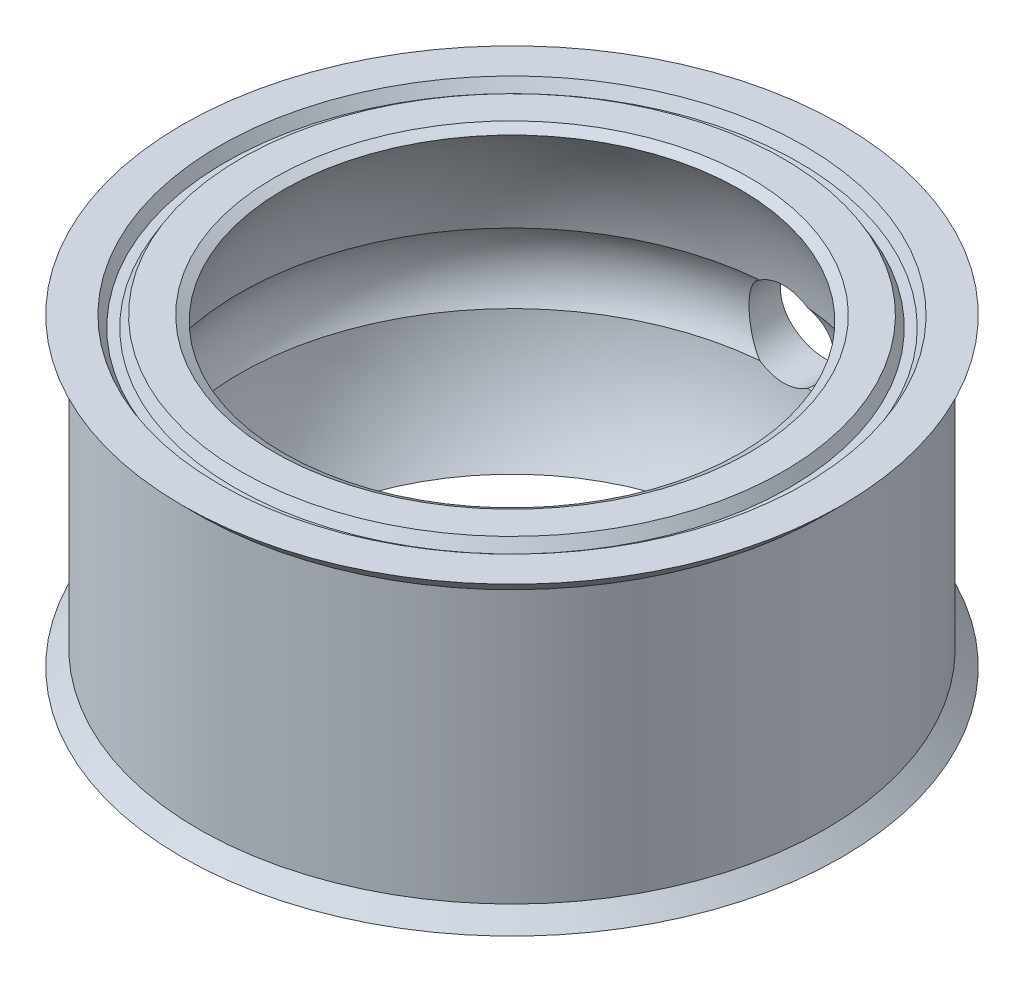
ISO-10303-21;
HEADER;
FILE_DESCRIPTION(('STEP AP214'),'2;1');
FILE_NAME('part.step','',(''),(''),'','','');
FILE_SCHEMA(('AUTOMOTIVE_DESIGN { 1 0 10303 214 1 1 1 1 }'));
ENDSEC;
DATA;
#1=APPLICATION_CONTEXT('core data for automotive mechanical design processes');
#2=APPLICATION_PROTOCOL_DEFINITION('international standard','automotive_design',2000,#1);
#3=PRODUCT_CONTEXT('',#1,'mechanical');
#4=PRODUCT('Part','Part','',(#3));
#5=PRODUCT_RELATED_PRODUCT_CATEGORY('part','',(#4));
#6=PRODUCT_DEFINITION_FORMATION('','',#4);
#7=PRODUCT_DEFINITION_CONTEXT('part definition',#1,'design');
#8=PRODUCT_DEFINITION('design','',#6,#7);
#9=PRODUCT_DEFINITION_SHAPE('','',#8);
#10=(LENGTH_UNIT() NAMED_UNIT(*) SI_UNIT(.MILLI.,.METRE.));
#11=(NAMED_UNIT(*) PLANE_ANGLE_UNIT() SI_UNIT($,.RADIAN.));
#12=(NAMED_UNIT(*) SI_UNIT($,.STERADIAN.) SOLID_ANGLE_UNIT());
#13=UNCERTAINTY_MEASURE_WITH_UNIT(LENGTH_MEASURE(1.E-05),#10,'distance_accuracy_value','');
#14=(GEOMETRIC_REPRESENTATION_CONTEXT(3) GLOBAL_UNCERTAINTY_ASSIGNED_CONTEXT((#13)) GLOBAL_UNIT_ASSIGNED_CONTEXT((#10,
#11,#12)) REPRESENTATION_CONTEXT('',''));
#15=CARTESIAN_POINT('',(0.,0.,0.));
#16=DIRECTION('',(0.,0.,1.));
#17=DIRECTION('',(1.,0.,0.));
#18=AXIS2_PLACEMENT_3D('',#15,#16,#17);
#19=CARTESIAN_POINT('',(5.56982142118956,-3.56870000217154,39.6748));
#20=DIRECTION('',(0.,-1.,0.));
#21=DIRECTION('',(1.,0.,0.));
#22=AXIS2_PLACEMENT_3D('',#19,#20,#21);
#23=PLANE('',#22);
#24=CARTESIAN_POINT('',(0.,-3.56869999816029,39.6748));
#25=DIRECTION('',(0.,1.,0.));
#26=DIRECTION('',(0.,0.,1.));
#27=AXIS2_PLACEMENT_3D('',#24,#25,#26);
#28=CIRCLE('',#27,6.858);
#29=CARTESIAN_POINT('',(0.,-3.56869999816029,46.5328));
#30=VERTEX_POINT('',#29);
#31=EDGE_CURVE('E208',#30,#30,#28,.T.);
#32=ORIENTED_EDGE('',*,*,#31,.T.);
#33=EDGE_LOOP('',(#32));
#34=FACE_BOUND('',#33,.T.);
#35=CARTESIAN_POINT('',(0.,-3.56870000217154,39.6748));
#36=DIRECTION('',(0.,-1.,0.));
#37=DIRECTION('',(1.,0.,0.));
#38=AXIS2_PLACEMENT_3D('',#35,#36,#37);
#39=CIRCLE('',#38,7.72160000026945);
#40=CARTESIAN_POINT('',(7.72160000026945,-3.56870000217154,39.6748));
#41=VERTEX_POINT('',#40);
#42=EDGE_CURVE('E88',#41,#41,#39,.T.);
#43=ORIENTED_EDGE('',*,*,#42,.T.);
#44=EDGE_LOOP('',(#43));
#45=FACE_BOUND('',#44,.T.);
#46=ADVANCED_FACE('F34',(#34,#45),#23,.T.);
#47=CARTESIAN_POINT('',(7.72160000026946,3.56869999816029,39.6748));
#48=DIRECTION('',(0.,1.,0.));
#49=DIRECTION('',(-1.,0.,0.));
#50=AXIS2_PLACEMENT_3D('',#47,#48,#49);
#51=PLANE('',#50);
#52=CARTESIAN_POINT('',(0.,3.56869999816029,39.6748));
#53=DIRECTION('',(0.,1.,0.));
#54=DIRECTION('',(0.,0.,1.));
#55=AXIS2_PLACEMENT_3D('',#52,#53,#54);
#56=CIRCLE('',#55,6.858);
#57=CARTESIAN_POINT('',(0.,3.56869999816029,46.5328));
#58=VERTEX_POINT('',#57);
#59=EDGE_CURVE('E74',#58,#58,#56,.T.);
#60=ORIENTED_EDGE('',*,*,#59,.F.);
#61=EDGE_LOOP('',(#60));
#62=FACE_BOUND('',#61,.T.);
#63=CARTESIAN_POINT('',(0.,3.56869999816029,39.6748));
#64=DIRECTION('',(0.,-1.,0.));
#65=DIRECTION('',(1.,0.,0.));
#66=AXIS2_PLACEMENT_3D('',#63,#64,#65);
#67=CIRCLE('',#66,7.72160000026946);
#68=CARTESIAN_POINT('',(7.72160000026946,3.56869999816029,39.6748));
#69=VERTEX_POINT('',#68);
#70=EDGE_CURVE('E97',#69,#69,#67,.T.);
#71=ORIENTED_EDGE('',*,*,#70,.F.);
#72=EDGE_LOOP('',(#71));
#73=FACE_BOUND('',#72,.T.);
#74=ADVANCED_FACE('F118',(#62,#73),#51,.T.);
#75=CARTESIAN_POINT('',(0.,-2.00562358475822E-09,39.6748));
#76=DIRECTION('',(0.,-1.,0.));
#77=DIRECTION('',(1.,0.,0.));
#78=AXIS2_PLACEMENT_3D('',#75,#76,#77);
#79=DEGENERATE_TOROIDAL_SURFACE('',#78,0.508000000026751,5.93668303344632,.T.);
#80=CARTESIAN_POINT('',(0.560480540168816,0.816792460844283,33.3112089938089));
#81=CARTESIAN_POINT('',(0.537502052937161,0.832559988755573,33.3113838663907));
#82=CARTESIAN_POINT('',(0.513868979257643,0.847350036912555,33.3115529975649));
#83=CARTESIAN_POINT('',(0.465442704161055,0.874887480575592,33.311875286534));
#84=CARTESIAN_POINT('',(0.440649556528376,0.887634970659561,33.3120284450684));
#85=CARTESIAN_POINT('',(0.36483086465955,0.922646913335541,33.3124567948884));
#86=CARTESIAN_POINT('',(0.312291914077312,0.941731617333205,33.3127014459935));
#87=CARTESIAN_POINT('',(0.204761585952515,0.970808348838212,33.3130803538454));
#88=CARTESIAN_POINT('',(0.149769235382226,0.980796734471226,33.3132145663741));
#89=CARTESIAN_POINT('',(0.0388830224720886,0.99140096503723,33.3133571938313));
#90=CARTESIAN_POINT('',(-0.0170107793777262,0.99201743625531,33.3133656171659));
#91=CARTESIAN_POINT('',(-0.128116368190606,0.983859977085441,33.3132556881858));
#92=CARTESIAN_POINT('',(-0.183327961128961,0.975083434737122,33.3131373006083));
#93=CARTESIAN_POINT('',(-0.29148288216971,0.948379096458765,33.3127872623009));
#94=CARTESIAN_POINT('',(-0.344427536193431,0.930456731370534,33.312555678791));
#95=CARTESIAN_POINT('',(-0.424364453285167,0.895656460923246,33.3121255855073));
#96=CARTESIAN_POINT('',(-0.452660086376198,0.881691986267843,33.3119562370532));
#97=CARTESIAN_POINT('',(-0.50774156061375,0.851161764228608,33.3115966895322));
#98=CARTESIAN_POINT('',(-0.534530142853845,0.834600961685786,33.3114065303042));
#99=CARTESIAN_POINT('',(-0.560480540166032,0.816792460846193,33.311208993809));
#100=B_SPLINE_CURVE_WITH_KNOTS('',3,(#80,#81,#82,#83,#84,#85,#86,#87,#88,#89,#90,#91,#92,#93,
#94,#95,#96,#97,#98,#99),.UNSPECIFIED.,.F.,.F.,(4,2,2,2,2,2,2,2,2,4),(0.,0.0835543025547794,
0.167104735120907,0.333939395898352,0.500840822599034,0.667731095939811,0.834667789320818,
1.00150546988861,1.09603982087185,1.19039626587853),.UNSPECIFIED.);
#101=CARTESIAN_POINT('',(0.560188967153449,0.816992460846205,33.3112112118187));
#102=VERTEX_POINT('',#101);
#103=CARTESIAN_POINT('',(-0.56018896715345,0.816992460846205,33.3112112118187));
#104=VERTEX_POINT('',#103);
#105=EDGE_CURVE('E53',#102,#104,#100,.T.);
#106=ORIENTED_EDGE('',*,*,#105,.F.);
#107=CARTESIAN_POINT('',(0.,0.816992460846205,39.6748));
#108=DIRECTION('',(0.,-1.,0.));
#109=DIRECTION('',(1.,0.,0.));
#110=AXIS2_PLACEMENT_3D('',#107,#108,#109);
#111=CIRCLE('',#110,6.38819802009825);
#112=EDGE_CURVE('E78',#102,#104,#111,.T.);
#113=ORIENTED_EDGE('',*,*,#112,.T.);
#114=EDGE_LOOP('',(#106,#113));
#115=FACE_BOUND('',#114,.T.);
#116=CARTESIAN_POINT('',(0.,3.43981344211672,39.6748));
#117=DIRECTION('',(0.,-1.,0.));
#118=DIRECTION('',(1.,0.,0.));
#119=AXIS2_PLACEMENT_3D('',#116,#117,#118);
#120=CIRCLE('',#119,5.34658335770952);
#121=CARTESIAN_POINT('',(5.34658335770952,3.43981344211672,39.6748));
#122=VERTEX_POINT('',#121);
#123=EDGE_CURVE('E68',#122,#122,#120,.T.);
#124=ORIENTED_EDGE('',*,*,#123,.F.);
#125=EDGE_LOOP('',(#124));
#126=FACE_BOUND('',#125,.T.);
#127=ADVANCED_FACE('F115',(#115,#126),#79,.F.);
#128=CARTESIAN_POINT('',(0.,3.56869999816029,39.6748));
#129=DIRECTION('',(0.,1.,0.));
#130=DIRECTION('',(-1.,0.,0.));
#131=AXIS2_PLACEMENT_3D('',#128,#129,#130);
#132=CONICAL_SURFACE('',#131,5.56982142118957,1.0471975511966);
#133=ORIENTED_EDGE('',*,*,#123,.T.);
#134=EDGE_LOOP('',(#133));
#135=FACE_BOUND('',#134,.T.);
#136=CARTESIAN_POINT('',(0.,3.56869999816029,39.6748));
#137=DIRECTION('',(0.,-1.,0.));
#138=DIRECTION('',(1.,0.,0.));
#139=AXIS2_PLACEMENT_3D('',#136,#137,#138);
#140=CIRCLE('',#139,5.56982142118957);
#141=CARTESIAN_POINT('',(5.56982142118957,3.56869999816029,39.6748));
#142=VERTEX_POINT('',#141);
#143=EDGE_CURVE('E100',#142,#142,#140,.T.);
#144=ORIENTED_EDGE('',*,*,#143,.F.);
#145=EDGE_LOOP('',(#144));
#146=FACE_BOUND('',#145,.T.);
#147=ADVANCED_FACE('F113',(#135,#146),#132,.F.);
#148=CARTESIAN_POINT('',(0.,3.56869999816029,39.6748));
#149=DIRECTION('',(0.,1.,0.));
#150=DIRECTION('',(0.,0.,1.));
#151=AXIS2_PLACEMENT_3D('',#148,#149,#150);
#152=CIRCLE('',#151,6.35);
#153=CARTESIAN_POINT('',(0.,3.56869999816029,46.0248));
#154=VERTEX_POINT('',#153);
#155=EDGE_CURVE('E205',#154,#154,#152,.T.);
#156=ORIENTED_EDGE('',*,*,#155,.T.);
#157=EDGE_LOOP('',(#156));
#158=FACE_BOUND('',#157,.T.);
#159=ORIENTED_EDGE('',*,*,#143,.T.);
#160=EDGE_LOOP('',(#159));
#161=FACE_BOUND('',#160,.T.);
#162=ADVANCED_FACE('F132',(#158,#161),#51,.T.);
#163=CARTESIAN_POINT('',(0.,3.18769999816029,39.6748));
#164=DIRECTION('',(0.,1.,0.));
#165=DIRECTION('',(-1.,0.,0.));
#166=AXIS2_PLACEMENT_3D('',#163,#164,#165);
#167=CONICAL_SURFACE('',#166,7.34060000026946,0.785398163397448);
#168=ORIENTED_EDGE('',*,*,#70,.T.);
#169=EDGE_LOOP('',(#168));
#170=FACE_BOUND('',#169,.T.);
#171=CARTESIAN_POINT('',(0.,3.18769999816029,39.6748));
#172=DIRECTION('',(0.,-1.,0.));
#173=DIRECTION('',(1.,0.,0.));
#174=AXIS2_PLACEMENT_3D('',#171,#172,#173);
#175=CIRCLE('',#174,7.34060000026946);
#176=CARTESIAN_POINT('',(7.34060000026946,3.18769999816029,39.6748));
#177=VERTEX_POINT('',#176);
#178=EDGE_CURVE('E94',#177,#177,#175,.T.);
#179=ORIENTED_EDGE('',*,*,#178,.F.);
#180=EDGE_LOOP('',(#179));
#181=FACE_BOUND('',#180,.T.);
#182=ADVANCED_FACE('F123',(#170,#181),#167,.T.);
#183=CARTESIAN_POINT('',(0.,3.5687,39.6748));
#184=DIRECTION('',(0.,-1.,0.));
#185=DIRECTION('',(1.,0.,0.));
#186=AXIS2_PLACEMENT_3D('',#183,#184,#185);
#187=CYLINDRICAL_SURFACE('',#186,7.34060000026946);
#188=CARTESIAN_POINT('',(-0.990599999999993,0.,32.4013468995837));
#189=CARTESIAN_POINT('',(-0.990597669491007,0.0553699515225847,32.4013460500541));
#190=CARTESIAN_POINT('',(-0.985941936407143,0.110773583878402,32.4007078022195));
#191=CARTESIAN_POINT('',(-0.967444427311823,0.220036276130033,32.3982250242953));
#192=CARTESIAN_POINT('',(-0.953593292913143,0.273893704100003,32.3963792653197));
#193=CARTESIAN_POINT('',(-0.917123085693167,0.378466375763406,32.3916942456895));
#194=CARTESIAN_POINT('',(-0.894510256195345,0.429183827132163,32.3888556926102));
#195=CARTESIAN_POINT('',(-0.841172452445398,0.526095699908015,32.3825057652261));
#196=CARTESIAN_POINT('',(-0.81044876287526,0.57229083601919,32.378994497497));
#197=CARTESIAN_POINT('',(-0.741547666208079,0.659155721872196,32.3716692213863));
#198=CARTESIAN_POINT('',(-0.703327985644825,0.69979180592522,32.3678535724431));
#199=CARTESIAN_POINT('',(-0.620610960347469,0.774093911253501,32.3603641698845));
#200=CARTESIAN_POINT('',(-0.576113291420844,0.807759572357548,32.3566904236096));
#201=CARTESIAN_POINT('',(-0.481890134578721,0.86728736271777,32.3498818084396));
#202=CARTESIAN_POINT('',(-0.432145091828334,0.893118805251065,32.3467490788146));
#203=CARTESIAN_POINT('',(-0.328973471335608,0.936048210862284,32.341393558783));
#204=CARTESIAN_POINT('',(-0.275547052044928,0.953146549559209,32.3391707292415));
#205=CARTESIAN_POINT('',(-0.166874637935769,0.978023200721623,32.3358970250017));
#206=CARTESIAN_POINT('',(-0.111641712873694,0.985857664030267,32.3348390922686));
#207=CARTESIAN_POINT('',(-0.00063568907488079,0.992158317966839,32.3339902453674));
#208=CARTESIAN_POINT('',(0.05513738498523,0.990624934566552,32.3341992735885));
#209=CARTESIAN_POINT('',(0.165258082723779,0.978278162293752,32.3358551133778));
#210=CARTESIAN_POINT('',(0.219612616264861,0.967525169497037,32.3372938690214));
#211=CARTESIAN_POINT('',(0.325738587968248,0.937138975188501,32.3412384970158));
#212=CARTESIAN_POINT('',(0.377509970255579,0.91750558168114,32.3437443924382));
#213=CARTESIAN_POINT('',(0.477185443493441,0.86985258609297,32.3495556226811));
#214=CARTESIAN_POINT('',(0.52507701812556,0.841807115872117,32.3528634173324));
#215=CARTESIAN_POINT('',(0.61549689552804,0.778144916605985,32.3599089002496));
#216=CARTESIAN_POINT('',(0.658024911676323,0.742527783213096,32.3636466114695));
#217=CARTESIAN_POINT('',(0.736865742876136,0.664395701764337,32.3711693097056));
#218=CARTESIAN_POINT('',(0.773126364105404,0.62182807981755,32.3749544361633));
#219=CARTESIAN_POINT('',(0.837996727162474,0.531183552727236,32.3821161106146));
#220=CARTESIAN_POINT('',(0.866606437275565,0.483106624747602,32.3854926569145));
#221=CARTESIAN_POINT('',(0.915367357997208,0.382758742172451,32.3914547756112));
#222=CARTESIAN_POINT('',(0.935513943297722,0.330485512732747,32.394039915276));
#223=CARTESIAN_POINT('',(0.966728111062954,0.223255046254367,32.3981183923143));
#224=CARTESIAN_POINT('',(0.977796206442471,0.168297961033568,32.3996117913683));
#225=CARTESIAN_POINT('',(0.990469166575898,0.0577220650414841,32.4013262471642));
#226=CARTESIAN_POINT('',(0.992147685169155,0.00211184353783993,32.4015572064243));
#227=CARTESIAN_POINT('',(0.986188597090551,-0.108596557469694,32.4007468586995));
#228=CARTESIAN_POINT('',(0.978551222811248,-0.163694749712024,32.3997055834516));
#229=CARTESIAN_POINT('',(0.954239334325206,-0.271591533688409,32.3964771499476));
#230=CARTESIAN_POINT('',(0.937600871807264,-0.324398397463716,32.3942945640926));
#231=CARTESIAN_POINT('',(0.895796368714109,-0.426473095186238,32.3890331599288));
#232=CARTESIAN_POINT('',(0.870629982061454,-0.475740785409504,32.3859543052485));
#233=CARTESIAN_POINT('',(0.812304479795047,-0.569670689334479,32.3792236957321));
#234=CARTESIAN_POINT('',(0.77909729761987,-0.614302808742948,32.3755685435412));
#235=CARTESIAN_POINT('',(0.705700354716135,-0.697386701637184,32.3681076791353));
#236=CARTESIAN_POINT('',(0.665510276346656,-0.735838193822735,32.3643019600773));
#237=CARTESIAN_POINT('',(0.578965645301047,-0.805730245816557,32.3569381465101));
#238=CARTESIAN_POINT('',(0.53257170253057,-0.837122250402232,32.3533818762069));
#239=CARTESIAN_POINT('',(0.435126514481797,-0.891667384227049,32.3469453221224));
#240=CARTESIAN_POINT('',(0.38407537614897,-0.914820702595388,32.3440650228239));
#241=CARTESIAN_POINT('',(0.278922607756494,-0.952152019204726,32.3393129970575));
#242=CARTESIAN_POINT('',(0.224830881986138,-0.966357506047818,32.3374381843008));
#243=CARTESIAN_POINT('',(0.115002887020022,-0.985479180122798,32.3348955012376));
#244=CARTESIAN_POINT('',(0.0592667050610041,-0.990395859219909,32.334227567024));
#245=CARTESIAN_POINT('',(-0.0517951695230923,-0.990790100932533,32.3341743272325));
#246=CARTESIAN_POINT('',(-0.107120607015581,-0.986342312164858,32.3347788780619));
#247=CARTESIAN_POINT('',(-0.216229718562717,-0.968292693903774,32.3371824146085));
#248=CARTESIAN_POINT('',(-0.270013395008961,-0.954690878610993,32.3389813984728));
#249=CARTESIAN_POINT('',(-0.374498403789437,-0.918743929883897,32.3435726141672));
#250=CARTESIAN_POINT('',(-0.425201197805932,-0.896402980627155,32.3463643706133));
#251=CARTESIAN_POINT('',(-0.522150072206474,-0.843619723597452,32.3526329445687));
#252=CARTESIAN_POINT('',(-0.568396064439586,-0.813177255629602,32.3561097756239));
#253=CARTESIAN_POINT('',(-0.655499015601505,-0.744781168142056,32.3633940371431));
#254=CARTESIAN_POINT('',(-0.696312273320169,-0.706772137329012,32.3672037826861));
#255=CARTESIAN_POINT('',(-0.771009551908028,-0.624437876611388,32.3747064574971));
#256=CARTESIAN_POINT('',(-0.804891936233647,-0.580111159133893,32.3783993590019));
#257=CARTESIAN_POINT('',(-0.864899066621752,-0.486168128026008,32.3852679828693));
#258=CARTESIAN_POINT('',(-0.890988183224404,-0.436528888224735,32.3884413008255));
#259=CARTESIAN_POINT('',(-0.934421774324633,-0.333556780706133,32.3938833204848));
#260=CARTESIAN_POINT('',(-0.951775596313995,-0.280227931009377,32.3961529886223));
#261=CARTESIAN_POINT('',(-0.97317213389441,-0.18886352744382,32.3989896105588));
#262=CARTESIAN_POINT('',(-0.979697962705498,-0.151400053403195,32.3998690859066));
#263=CARTESIAN_POINT('',(-0.988412674774588,-0.0759630012876497,32.4010480191137));
#264=CARTESIAN_POINT('',(-0.990601598966598,-0.0379894280307217,32.4013474824475));
#265=CARTESIAN_POINT('',(-0.990599999999993,0.,32.4013468995837));
#266=B_SPLINE_CURVE_WITH_KNOTS('',3,(#188,#189,#190,#191,#192,#193,#194,#195,#196,#197,#198,
#199,#200,#201,#202,#203,#204,#205,#206,#207,#208,#209,#210,#211,#212,#213,#214,#215,#216,#217,
#218,#219,#220,#221,#222,#223,#224,#225,#226,#227,#228,#229,#230,#231,#232,#233,#234,#235,#236,
#237,#238,#239,#240,#241,#242,#243,#244,#245,#246,#247,#248,#249,#250,#251,#252,#253,#254,#255,
#256,#257,#258,#259,#260,#261,#262,#263,#264,#265),.UNSPECIFIED.,.T.,.F.,(4,2,2,2,2,2,2,2,2,2,2,
2,2,2,2,2,2,2,2,2,2,2,2,2,2,2,2,2,2,2,2,2,2,2,2,2,2,2,4),(0.,0.165971046203975,
0.332111264721142,0.498133313733364,0.664129082215476,0.831089390886333,0.998058324471047,
1.16567307267724,1.33328061100838,1.49986694064772,1.66644569538215,1.83194148661735,
1.99744085606641,2.16345446650059,2.32947694474564,2.49682159249536,2.66416693391476,
2.83160361510706,2.99903083584182,3.16514286032419,3.33125074109116,3.49669818998892,
3.66215235382546,3.82862111358812,3.99509744773527,4.16268598530994,4.33027067543492,
4.49733798551473,4.66439644872145,4.83012825362822,4.99585980143603,5.16151209618224,
5.32716766668748,5.49408421495866,5.66104013080563,5.82874805168234,5.99627612758069,
6.1101502498026,6.22402329721493),.UNSPECIFIED.);
#267=CARTESIAN_POINT('',(-0.990599999999993,0.,32.4013468995837));
#268=VERTEX_POINT('',#267);
#269=EDGE_CURVE('E73',#268,#268,#266,.T.);
#270=ORIENTED_EDGE('',*,*,#269,.F.);
#271=EDGE_LOOP('',(#270));
#272=FACE_BOUND('',#271,.T.);
#273=ORIENTED_EDGE('',*,*,#178,.T.);
#274=EDGE_LOOP('',(#273));
#275=FACE_BOUND('',#274,.T.);
#276=CARTESIAN_POINT('',(0.,-3.18770000183971,39.6748));
#277=DIRECTION('',(0.,-1.,0.));
#278=DIRECTION('',(1.,0.,0.));
#279=AXIS2_PLACEMENT_3D('',#276,#277,#278);
#280=CIRCLE('',#279,7.34060000026946);
#281=CARTESIAN_POINT('',(7.34060000026946,-3.18770000183971,39.6748));
#282=VERTEX_POINT('',#281);
#283=EDGE_CURVE('E91',#282,#282,#280,.T.);
#284=ORIENTED_EDGE('',*,*,#283,.F.);
#285=EDGE_LOOP('',(#284));
#286=FACE_BOUND('',#285,.T.);
#287=ADVANCED_FACE('F120',(#272,#275,#286),#187,.T.);
#288=CARTESIAN_POINT('',(0.,-3.56870000217154,39.6748));
#289=DIRECTION('',(0.,-1.,0.));
#290=DIRECTION('',(1.,0.,0.));
#291=AXIS2_PLACEMENT_3D('',#288,#289,#290);
#292=CONICAL_SURFACE('',#291,7.72160000026945,0.785398162961956);
#293=ORIENTED_EDGE('',*,*,#283,.T.);
#294=EDGE_LOOP('',(#293));
#295=FACE_BOUND('',#294,.T.);
#296=ORIENTED_EDGE('',*,*,#42,.F.);
#297=EDGE_LOOP('',(#296));
#298=FACE_BOUND('',#297,.T.);
#299=ADVANCED_FACE('F122',(#295,#298),#292,.T.);
#300=CARTESIAN_POINT('',(0.,-3.56869999816029,39.6748));
#301=DIRECTION('',(0.,1.,0.));
#302=DIRECTION('',(0.,0.,1.));
#303=AXIS2_PLACEMENT_3D('',#300,#301,#302);
#304=CIRCLE('',#303,6.35);
#305=CARTESIAN_POINT('',(0.,-3.56869999816029,46.0248));
#306=VERTEX_POINT('',#305);
#307=EDGE_CURVE('E156',#306,#306,#304,.T.);
#308=ORIENTED_EDGE('',*,*,#307,.F.);
#309=EDGE_LOOP('',(#308));
#310=FACE_BOUND('',#309,.T.);
#311=CARTESIAN_POINT('',(0.,-3.56870000217154,39.6748));
#312=DIRECTION('',(0.,-1.,0.));
#313=DIRECTION('',(1.,0.,0.));
#314=AXIS2_PLACEMENT_3D('',#311,#312,#313);
#315=CIRCLE('',#314,5.56982142118956);
#316=CARTESIAN_POINT('',(5.56982142118956,-3.56870000217154,39.6748));
#317=VERTEX_POINT('',#316);
#318=EDGE_CURVE('E81',#317,#317,#315,.T.);
#319=ORIENTED_EDGE('',*,*,#318,.F.);
#320=EDGE_LOOP('',(#319));
#321=FACE_BOUND('',#320,.T.);
#322=ADVANCED_FACE('F129',(#310,#321),#23,.T.);
#323=CARTESIAN_POINT('',(0.,-3.43981344612797,39.6748));
#324=DIRECTION('',(0.,-1.,0.));
#325=DIRECTION('',(1.,0.,0.));
#326=AXIS2_PLACEMENT_3D('',#323,#324,#325);
#327=CONICAL_SURFACE('',#326,5.34658335770951,1.0471975511966);
#328=ORIENTED_EDGE('',*,*,#318,.T.);
#329=EDGE_LOOP('',(#328));
#330=FACE_BOUND('',#329,.T.);
#331=CARTESIAN_POINT('',(0.,-3.43981344612797,39.6748));
#332=DIRECTION('',(0.,-1.,0.));
#333=DIRECTION('',(1.,0.,0.));
#334=AXIS2_PLACEMENT_3D('',#331,#332,#333);
#335=CIRCLE('',#334,5.34658335770951);
#336=CARTESIAN_POINT('',(5.34658335770951,-3.43981344612797,39.6748));
#337=VERTEX_POINT('',#336);
#338=EDGE_CURVE('E77',#337,#337,#335,.T.);
#339=ORIENTED_EDGE('',*,*,#338,.F.);
#340=EDGE_LOOP('',(#339));
#341=FACE_BOUND('',#340,.T.);
#342=ADVANCED_FACE('F147',(#330,#341),#327,.F.);
#343=CARTESIAN_POINT('',(0.,-2.00562358475822E-09,39.6748));
#344=DIRECTION('',(0.,-1.,0.));
#345=DIRECTION('',(1.,0.,0.));
#346=AXIS2_PLACEMENT_3D('',#343,#344,#345);
#347=DEGENERATE_TOROIDAL_SURFACE('',#346,0.508000000026751,5.93668303344632,.T.);
#348=CARTESIAN_POINT('',(-0.560480541901817,-0.816792459655101,33.3112089932364));
#349=CARTESIAN_POINT('',(-0.537502054703567,-0.832559987615179,33.3113838658076));
#350=CARTESIAN_POINT('',(-0.513868981055384,-0.847350035822329,33.311552996972));
#351=CARTESIAN_POINT('',(-0.465442706017141,-0.874887479588149,33.311875285923));
#352=CARTESIAN_POINT('',(-0.440649558411472,-0.887634969724732,33.3120284444491));
#353=CARTESIAN_POINT('',(-0.364830866616325,-0.922646912561834,33.3124567942465));
#354=CARTESIAN_POINT('',(-0.312291916073985,-0.941731616671114,33.3127014453398));
#355=CARTESIAN_POINT('',(-0.204761588009664,-0.970808348404352,33.3130803531744));
#356=CARTESIAN_POINT('',(-0.149769237459943,-0.980796734153977,33.3132145656977));
#357=CARTESIAN_POINT('',(-0.0388830245717796,-0.991400964954882,33.3133571931508));
#358=CARTESIAN_POINT('',(0.0170107772766167,-0.99201743629136,33.3133656164866));
#359=CARTESIAN_POINT('',(0.128116366106318,-0.983859977356803,33.3132556875153));
#360=CARTESIAN_POINT('',(0.183327959062925,-0.975083435125468,33.3131372999453));
#361=CARTESIAN_POINT('',(0.291482880160913,-0.948379097076297,33.3127872616591));
#362=CARTESIAN_POINT('',(0.344427534223533,-0.930456732099948,33.3125556781628));
#363=CARTESIAN_POINT('',(0.42436445203376,-0.895656461540837,33.3121255849013));
#364=CARTESIAN_POINT('',(0.452660085770102,-0.881691986603965,33.3119562364532));
#365=CARTESIAN_POINT('',(0.507741561232882,-0.851161763885258,33.3115966889452));
#366=CARTESIAN_POINT('',(0.534530144052985,-0.834600960944599,33.3114065297241));
#367=CARTESIAN_POINT('',(0.5604805419046,-0.816792459653191,33.3112089932364));
#368=B_SPLINE_CURVE_WITH_KNOTS('',3,(#348,#349,#350,#351,#352,#353,#354,#355,#356,#357,#358,
#359,#360,#361,#362,#363,#364,#365,#366,#367),.UNSPECIFIED.,.F.,.F.,(4,2,2,2,2,2,2,2,2,4),(0.,
0.0835543025547581,0.16710473512086,0.333939395899959,0.500840822602372,0.66773109594294,
0.834667789322473,1.00150546989467,1.09603982297816,1.19039627008302),.UNSPECIFIED.);
#369=CARTESIAN_POINT('',(-0.560188968890562,-0.816992459655115,33.311211211246));
#370=VERTEX_POINT('',#369);
#371=CARTESIAN_POINT('',(0.560188968890561,-0.816992459655115,33.311211211246));
#372=VERTEX_POINT('',#371);
#373=EDGE_CURVE('E63',#370,#372,#368,.T.);
#374=ORIENTED_EDGE('',*,*,#373,.F.);
#375=CARTESIAN_POINT('',(0.,-0.816992459655113,39.6748));
#376=DIRECTION('',(0.,-1.,0.));
#377=DIRECTION('',(1.,0.,0.));
#378=AXIS2_PLACEMENT_3D('',#375,#376,#377);
#379=CIRCLE('',#378,6.38819802082106);
#380=EDGE_CURVE('E72',#372,#370,#379,.T.);
#381=ORIENTED_EDGE('',*,*,#380,.F.);
#382=EDGE_LOOP('',(#374,#381));
#383=FACE_BOUND('',#382,.T.);
#384=ORIENTED_EDGE('',*,*,#338,.T.);
#385=EDGE_LOOP('',(#384));
#386=FACE_BOUND('',#385,.T.);
#387=ADVANCED_FACE('F36',(#383,#386),#347,.F.);
#388=CARTESIAN_POINT('',(6.38819802009825,0.816992460846205,39.6748));
#389=CARTESIAN_POINT('',(6.47963891325647,0.66630968307929,39.6748));
#390=CARTESIAN_POINT('',(6.54632523014772,0.497761492436003,39.6748));
#391=CARTESIAN_POINT('',(6.58273464787587,0.32530543786608,39.6748));
#392=CARTESIAN_POINT('',(6.61914406560402,0.152849383296157,39.6748));
#393=CARTESIAN_POINT('',(6.62628080086419,-0.0282710861143198,39.6748));
#394=CARTESIAN_POINT('',(6.60355385750651,-0.203057305544641,39.6748));
#395=CARTESIAN_POINT('',(6.58082691414883,-0.377843524974961,39.6748));
#396=CARTESIAN_POINT('',(6.52760945501488,-0.551116314162912,39.6748));
#397=CARTESIAN_POINT('',(6.44830844103382,-0.70852687809908,39.6748));
#398=CARTESIAN_POINT('',(6.429710698425,-0.745442940139501,39.6748));
#399=CARTESIAN_POINT('',(6.40964281839708,-0.781654203845876,39.6748));
#400=CARTESIAN_POINT('',(6.38819802082106,-0.816992459655115,39.6748));
#401=B_SPLINE_CURVE_WITH_KNOTS('',3,(#388,#389,#390,#391,#392,#393,#394,#395,#396,#397,#398,
#399,#400),.UNSPECIFIED.,.F.,.F.,(4,3,3,3,4),(0.,0.000528772756592231,0.00105754551318446,
0.00158631826977669,0.00170866126612758),.UNSPECIFIED.);
#402=CARTESIAN_POINT('',(0.,3.5687,39.6748));
#403=DIRECTION('',(0.,-1.,0.));
#404=AXIS1_PLACEMENT('',#402,#403);
#405=SURFACE_OF_REVOLUTION('',#401,#404);
#406=CARTESIAN_POINT('',(0.560188968890561,-0.816992459655115,33.311211211246));
#407=CARTESIAN_POINT('',(0.583474801836227,-0.801021489439632,33.3035382035663));
#408=CARTESIAN_POINT('',(0.606035423115149,-0.784092183711102,33.2957187934697));
#409=CARTESIAN_POINT('',(0.649622414669925,-0.748381906058094,33.2800123560193));
#410=CARTESIAN_POINT('',(0.670648506140176,-0.729600599097459,33.2721253166675));
#411=CARTESIAN_POINT('',(0.731405952660978,-0.670469584226705,33.2486589931882));
#412=CARTESIAN_POINT('',(0.768678245083002,-0.627427634268803,33.2333223764655));
#413=CARTESIAN_POINT('',(0.835619506880355,-0.535062016430142,33.2047536144275));
#414=CARTESIAN_POINT('',(0.86527453569792,-0.485727074977106,33.191525344203));
#415=CARTESIAN_POINT('',(0.915770630648183,-0.382046865358342,33.168433042136));
#416=CARTESIAN_POINT('',(0.936628823056433,-0.327711585918331,33.1585624805973));
#417=CARTESIAN_POINT('',(0.960091436154778,-0.245483206482382,33.1473597787722));
#418=CARTESIAN_POINT('',(0.966508157924991,-0.218863758634821,33.1442764785379));
#419=CARTESIAN_POINT('',(0.977131494406738,-0.165087204227848,33.1391870742708));
#420=CARTESIAN_POINT('',(0.98133818804669,-0.137930116905513,33.1371809317684));
#421=CARTESIAN_POINT('',(0.990537211822309,-0.0559902971995695,33.1328123001383));
#422=CARTESIAN_POINT('',(0.992123907407529,-0.000685096346617002,33.1320922148829));
#423=CARTESIAN_POINT('',(0.986343023344057,0.104802815174278,33.1348977943645));
#424=CARTESIAN_POINT('',(0.979688568362804,0.155038364866823,33.1380851140327));
#425=CARTESIAN_POINT('',(0.958917766523828,0.253567705190705,33.1479532039812));
#426=CARTESIAN_POINT('',(0.944804197260436,0.301862211421323,33.1546326738591));
#427=CARTESIAN_POINT('',(0.909485253133479,0.395822866979257,33.1711646783433));
#428=CARTESIAN_POINT('',(0.888201444301709,0.441453094913044,33.1810522597322));
#429=CARTESIAN_POINT('',(0.839263487885972,0.52860790966975,33.2030753735943));
#430=CARTESIAN_POINT('',(0.811602351621157,0.570127920377819,33.2152133693357));
#431=CARTESIAN_POINT('',(0.74975904406704,0.649423688031673,33.2412095481391));
#432=CARTESIAN_POINT('',(0.715412840344349,0.687058203589142,33.2551070326725));
#433=CARTESIAN_POINT('',(0.641526072565955,0.756503447028417,33.283201308333));
#434=CARTESIAN_POINT('',(0.601997310961255,0.788327025806536,33.2973973596362));
#435=CARTESIAN_POINT('',(0.560188967153448,0.816992460846205,33.3112112118187));
#436=B_SPLINE_CURVE_WITH_KNOTS('',3,(#406,#407,#408,#409,#410,#411,#412,#413,#414,#415,#416,
#417,#418,#419,#420,#421,#422,#423,#424,#425,#426,#427,#428,#429,#430,#431,#432,#433,#434,#435),
.UNSPECIFIED.,.F.,.F.,(4,2,2,2,2,2,2,2,2,2,2,2,2,2,4),(0.,0.0877258748534512,0.175467648967143,
0.351467966287056,0.527788127712132,0.70376341454822,0.78632949874991,0.868892634005565,
1.03385178307052,1.18548264647468,1.33705708594297,1.49034652612056,1.64380475586518,
1.80165675566763,1.95915532199304),.UNSPECIFIED.);
#437=EDGE_CURVE('E11',#372,#102,#436,.T.);
#438=ORIENTED_EDGE('',*,*,#437,.F.);
#439=ORIENTED_EDGE('',*,*,#380,.T.);
#440=CARTESIAN_POINT('',(-0.560188967153451,0.816992460846205,33.3112112118187));
#441=CARTESIAN_POINT('',(-0.58348168830535,0.801017680042566,33.3035291415977));
#442=CARTESIAN_POINT('',(-0.606052963962534,0.784079489156074,33.29572029016));
#443=CARTESIAN_POINT('',(-0.649661427314282,0.748348260624727,33.2800459315815));
#444=CARTESIAN_POINT('',(-0.670698378455385,0.729554938012897,33.2721804159089));
#445=CARTESIAN_POINT('',(-0.731479687493907,0.670392055618647,33.248752019735));
#446=CARTESIAN_POINT('',(-0.768756000979108,0.627334631860155,33.2334049299569));
#447=CARTESIAN_POINT('',(-0.835698318868214,0.534938914045288,33.2047414239788));
#448=CARTESIAN_POINT('',(-0.865350002904148,0.485589057914622,33.1914288476884));
#449=CARTESIAN_POINT('',(-0.915839242819692,0.381889097478446,33.16828605245));
#450=CARTESIAN_POINT('',(-0.936693871031859,0.327548929837099,33.1584490944992));
#451=CARTESIAN_POINT('',(-0.967598177173579,0.219113275264819,33.1438308290523));
#452=CARTESIAN_POINT('',(-0.97826295436395,0.165232220604558,33.138762050918));
#453=CARTESIAN_POINT('',(-0.990523297288741,0.056204306187519,33.1328914589942));
#454=CARTESIAN_POINT('',(-0.992119044958515,0.00105747184604872,33.1320895596063));
#455=CARTESIAN_POINT('',(-0.986385975462445,-0.104441920874376,33.1347760042603));
#456=CARTESIAN_POINT('',(-0.979725725989471,-0.154840515217927,33.1379431530816));
#457=CARTESIAN_POINT('',(-0.958902548903323,-0.253661445004915,33.1479211640818));
#458=CARTESIAN_POINT('',(-0.94474190641982,-0.302084377532386,33.1547309164823));
#459=CARTESIAN_POINT('',(-0.909368635807938,-0.396075818140015,33.1713534585722));
#460=CARTESIAN_POINT('',(-0.88811112654011,-0.441623908289413,33.1811853281626));
#461=CARTESIAN_POINT('',(-0.839247473995584,-0.528626426371591,33.2030734218397));
#462=CARTESIAN_POINT('',(-0.811634890764101,-0.57007664036778,33.215131899807));
#463=CARTESIAN_POINT('',(-0.749827484428552,-0.649345761978381,33.2410598102668));
#464=CARTESIAN_POINT('',(-0.715454817478606,-0.687011844773376,33.254973866196));
#465=CARTESIAN_POINT('',(-0.660019249220611,-0.73912538543097,33.2761134087008));
#466=CARTESIAN_POINT('',(-0.640908987297853,-0.755755781832832,33.28319974044));
#467=CARTESIAN_POINT('',(-0.601457081791455,-0.787513472347173,33.297300265304));
#468=CARTESIAN_POINT('',(-0.581115588535332,-0.802640949365656,33.3043144671136));
#469=CARTESIAN_POINT('',(-0.560188968890563,-0.816992459655115,33.311211211246));
#470=B_SPLINE_CURVE_WITH_KNOTS('',3,(#440,#441,#442,#443,#444,#445,#446,#447,#448,#449,#450,
#451,#452,#453,#454,#455,#456,#457,#458,#459,#460,#461,#462,#463,#464,#465,#466,#467,#468,#469),
.UNSPECIFIED.,.F.,.F.,(4,2,2,2,2,2,2,2,2,2,2,2,2,2,4),(0.,0.0877568206461069,0.17552714266604,
0.351585280027049,0.527971708701317,0.704014233861382,0.868594668822831,1.03317180209635,
1.18525021370858,1.33728231852554,1.49029469733619,1.64346282030221,1.80138954068581,
1.88024538500824,1.95909162075088),.UNSPECIFIED.);
#471=EDGE_CURVE('E47',#104,#370,#470,.T.);
#472=ORIENTED_EDGE('',*,*,#471,.F.);
#473=ORIENTED_EDGE('',*,*,#112,.F.);
#474=EDGE_LOOP('',(#438,#439,#472,#473));
#475=FACE_BOUND('',#474,.T.);
#476=ADVANCED_FACE('F76',(#475),#405,.F.);
#477=CARTESIAN_POINT('',(0.,0.,32.3341999997305));
#478=DIRECTION('',(0.,0.,-1.));
#479=DIRECTION('',(-1.,0.,0.));
#480=AXIS2_PLACEMENT_3D('',#477,#478,#479);
#481=CYLINDRICAL_SURFACE('',#480,0.990599999999993);
#482=ORIENTED_EDGE('',*,*,#269,.T.);
#483=EDGE_LOOP('',(#482));
#484=FACE_BOUND('',#483,.T.);
#485=ORIENTED_EDGE('',*,*,#105,.T.);
#486=ORIENTED_EDGE('',*,*,#471,.T.);
#487=ORIENTED_EDGE('',*,*,#373,.T.);
#488=ORIENTED_EDGE('',*,*,#437,.T.);
#489=EDGE_LOOP('',(#485,#486,#487,#488));
#490=FACE_BOUND('',#489,.T.);
#491=ADVANCED_FACE('F62',(#484,#490),#481,.F.);
#492=CARTESIAN_POINT('',(0.,3.56869999816029,39.6748));
#493=DIRECTION('',(0.,1.,0.));
#494=DIRECTION('',(0.,0.,1.));
#495=AXIS2_PLACEMENT_3D('',#492,#493,#494);
#496=CONICAL_SURFACE('',#495,6.858,0.523598775598302);
#497=CARTESIAN_POINT('',(0.,3.31469999816029,39.6748));
#498=DIRECTION('',(0.,1.,0.));
#499=DIRECTION('',(0.,0.,1.));
#500=AXIS2_PLACEMENT_3D('',#497,#498,#499);
#501=CIRCLE('',#500,6.71135303162584);
#502=CARTESIAN_POINT('',(0.,3.31469999816029,46.3861530316258));
#503=VERTEX_POINT('',#502);
#504=EDGE_CURVE('E199',#503,#503,#501,.T.);
#505=ORIENTED_EDGE('',*,*,#504,.F.);
#506=EDGE_LOOP('',(#505));
#507=FACE_BOUND('',#506,.T.);
#508=ORIENTED_EDGE('',*,*,#59,.T.);
#509=EDGE_LOOP('',(#508));
#510=FACE_BOUND('',#509,.T.);
#511=ADVANCED_FACE('F167',(#507,#510),#496,.F.);
#512=CARTESIAN_POINT('',(0.,3.31469999816029,46.3861530316258));
#513=DIRECTION('',(0.,-1.,0.));
#514=DIRECTION('',(0.,0.,-1.));
#515=AXIS2_PLACEMENT_3D('',#512,#513,#514);
#516=PLANE('',#515);
#517=CARTESIAN_POINT('',(0.,3.31469999816029,39.6748));
#518=DIRECTION('',(0.,1.,0.));
#519=DIRECTION('',(0.,0.,1.));
#520=AXIS2_PLACEMENT_3D('',#517,#518,#519);
#521=CIRCLE('',#520,6.49664696837417);
#522=CARTESIAN_POINT('',(0.,3.31469999816029,46.1714469683742));
#523=VERTEX_POINT('',#522);
#524=EDGE_CURVE('E202',#523,#523,#521,.T.);
#525=ORIENTED_EDGE('',*,*,#524,.F.);
#526=EDGE_LOOP('',(#525));
#527=FACE_BOUND('',#526,.T.);
#528=ORIENTED_EDGE('',*,*,#504,.T.);
#529=EDGE_LOOP('',(#528));
#530=FACE_BOUND('',#529,.T.);
#531=ADVANCED_FACE('F173',(#527,#530),#516,.F.);
#532=CARTESIAN_POINT('',(0.,3.31469999816029,39.6748));
#533=DIRECTION('',(0.,-1.,0.));
#534=DIRECTION('',(0.,0.,-1.));
#535=AXIS2_PLACEMENT_3D('',#532,#533,#534);
#536=CONICAL_SURFACE('',#535,6.49664696837417,0.523598775598322);
#537=ORIENTED_EDGE('',*,*,#155,.F.);
#538=EDGE_LOOP('',(#537));
#539=FACE_BOUND('',#538,.T.);
#540=ORIENTED_EDGE('',*,*,#524,.T.);
#541=EDGE_LOOP('',(#540));
#542=FACE_BOUND('',#541,.T.);
#543=ADVANCED_FACE('F232',(#539,#542),#536,.T.);
#544=CARTESIAN_POINT('',(0.,-3.56869999816029,39.6748));
#545=DIRECTION('',(0.,-1.,0.));
#546=DIRECTION('',(0.,0.,1.));
#547=AXIS2_PLACEMENT_3D('',#544,#545,#546);
#548=CONICAL_SURFACE('',#547,6.858,0.523598775598302);
#549=CARTESIAN_POINT('',(0.,-3.31469999816029,39.6748));
#550=DIRECTION('',(0.,1.,0.));
#551=DIRECTION('',(0.,0.,1.));
#552=AXIS2_PLACEMENT_3D('',#549,#550,#551);
#553=CIRCLE('',#552,6.71135303162584);
#554=CARTESIAN_POINT('',(0.,-3.31469999816029,46.3861530316258));
#555=VERTEX_POINT('',#554);
#556=EDGE_CURVE('E210',#555,#555,#553,.T.);
#557=ORIENTED_EDGE('',*,*,#556,.T.);
#558=EDGE_LOOP('',(#557));
#559=FACE_BOUND('',#558,.T.);
#560=ORIENTED_EDGE('',*,*,#31,.F.);
#561=EDGE_LOOP('',(#560));
#562=FACE_BOUND('',#561,.T.);
#563=ADVANCED_FACE('F226',(#559,#562),#548,.F.);
#564=CARTESIAN_POINT('',(0.,-3.31469999816029,46.3861530316258));
#565=DIRECTION('',(0.,1.,0.));
#566=DIRECTION('',(0.,0.,-1.));
#567=AXIS2_PLACEMENT_3D('',#564,#565,#566);
#568=PLANE('',#567);
#569=CARTESIAN_POINT('',(0.,-3.31469999816029,39.6748));
#570=DIRECTION('',(0.,1.,0.));
#571=DIRECTION('',(0.,0.,1.));
#572=AXIS2_PLACEMENT_3D('',#569,#570,#571);
#573=CIRCLE('',#572,6.49664696837417);
#574=CARTESIAN_POINT('',(0.,-3.31469999816029,46.1714469683742));
#575=VERTEX_POINT('',#574);
#576=EDGE_CURVE('E213',#575,#575,#573,.T.);
#577=ORIENTED_EDGE('',*,*,#576,.T.);
#578=EDGE_LOOP('',(#577));
#579=FACE_BOUND('',#578,.T.);
#580=ORIENTED_EDGE('',*,*,#556,.F.);
#581=EDGE_LOOP('',(#580));
#582=FACE_BOUND('',#581,.T.);
#583=ADVANCED_FACE('F220',(#579,#582),#568,.F.);
#584=CARTESIAN_POINT('',(0.,-3.31469999816029,39.6748));
#585=DIRECTION('',(0.,1.,0.));
#586=DIRECTION('',(0.,0.,-1.));
#587=AXIS2_PLACEMENT_3D('',#584,#585,#586);
#588=CONICAL_SURFACE('',#587,6.49664696837417,0.523598775598322);
#589=ORIENTED_EDGE('',*,*,#307,.T.);
#590=EDGE_LOOP('',(#589));
#591=FACE_BOUND('',#590,.T.);
#592=ORIENTED_EDGE('',*,*,#576,.F.);
#593=EDGE_LOOP('',(#592));
#594=FACE_BOUND('',#593,.T.);
#595=ADVANCED_FACE('F217',(#591,#594),#588,.T.);
#596=CLOSED_SHELL('',(#46,#74,#127,#147,#162,#182,#287,#299,#322,#342,#387,#476,#491,#511,#531,
#543,#563,#583,#595));
#597=MANIFOLD_SOLID_BREP('B2',#596);
#598=ADVANCED_BREP_SHAPE_REPRESENTATION('',(#18,#597),#14);
#599=SHAPE_DEFINITION_REPRESENTATION(#9,#598);
ENDSEC;
END-ISO-10303-21;
